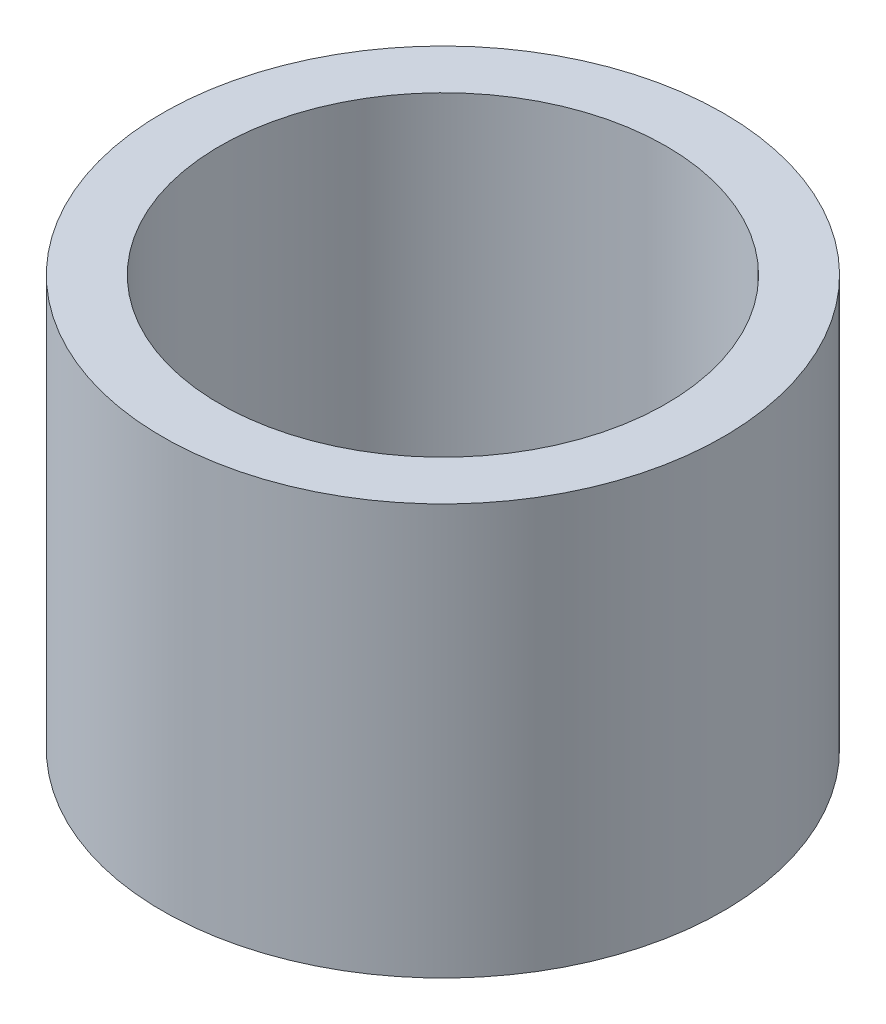
ISO-10303-21;
HEADER;
FILE_DESCRIPTION(('STEP AP214'),'2;1');
FILE_NAME('part.step','',(''),(''),'','','');
FILE_SCHEMA(('AUTOMOTIVE_DESIGN { 1 0 10303 214 1 1 1 1 }'));
ENDSEC;
DATA;
#1=APPLICATION_CONTEXT('core data for automotive mechanical design processes');
#2=APPLICATION_PROTOCOL_DEFINITION('international standard','automotive_design',2000,#1);
#3=PRODUCT_CONTEXT('',#1,'mechanical');
#4=PRODUCT('Part','Part','',(#3));
#5=PRODUCT_RELATED_PRODUCT_CATEGORY('part','',(#4));
#6=PRODUCT_DEFINITION_FORMATION('','',#4);
#7=PRODUCT_DEFINITION_CONTEXT('part definition',#1,'design');
#8=PRODUCT_DEFINITION('design','',#6,#7);
#9=PRODUCT_DEFINITION_SHAPE('','',#8);
#10=(LENGTH_UNIT() NAMED_UNIT(*) SI_UNIT(.MILLI.,.METRE.));
#11=(NAMED_UNIT(*) PLANE_ANGLE_UNIT() SI_UNIT($,.RADIAN.));
#12=(NAMED_UNIT(*) SI_UNIT($,.STERADIAN.) SOLID_ANGLE_UNIT());
#13=UNCERTAINTY_MEASURE_WITH_UNIT(LENGTH_MEASURE(1.E-05),#10,'distance_accuracy_value','');
#14=(GEOMETRIC_REPRESENTATION_CONTEXT(3) GLOBAL_UNCERTAINTY_ASSIGNED_CONTEXT((#13)) GLOBAL_UNIT_ASSIGNED_CONTEXT((#10,
#11,#12)) REPRESENTATION_CONTEXT('',''));
#15=CARTESIAN_POINT('',(0.,0.,0.));
#16=DIRECTION('',(0.,0.,1.));
#17=DIRECTION('',(1.,0.,0.));
#18=AXIS2_PLACEMENT_3D('',#15,#16,#17);
#19=CARTESIAN_POINT('',(0.,25.8695652173913,49.));
#20=DIRECTION('',(0.,-1.,0.));
#21=DIRECTION('',(0.,0.,-1.));
#22=AXIS2_PLACEMENT_3D('',#19,#20,#21);
#23=PLANE('',#22);
#24=CARTESIAN_POINT('',(0.,25.8695652173913,0.));
#25=DIRECTION('',(0.,-1.,0.));
#26=DIRECTION('',(0.,0.,-1.));
#27=AXIS2_PLACEMENT_3D('',#24,#25,#26);
#28=CIRCLE('',#27,49.);
#29=CARTESIAN_POINT('',(0.,25.8695652173913,-49.));
#30=VERTEX_POINT('',#29);
#31=EDGE_CURVE('E44',#30,#30,#28,.T.);
#32=ORIENTED_EDGE('',*,*,#31,.F.);
#33=EDGE_LOOP('',(#32));
#34=FACE_BOUND('',#33,.T.);
#35=CARTESIAN_POINT('',(0.,25.8695652173913,0.));
#36=DIRECTION('',(0.,-1.,0.));
#37=DIRECTION('',(0.,0.,-1.));
#38=AXIS2_PLACEMENT_3D('',#35,#36,#37);
#39=CIRCLE('',#38,39.);
#40=CARTESIAN_POINT('',(0.,25.8695652173913,-39.));
#41=VERTEX_POINT('',#40);
#42=EDGE_CURVE('E10',#41,#41,#39,.T.);
#43=ORIENTED_EDGE('',*,*,#42,.T.);
#44=EDGE_LOOP('',(#43));
#45=FACE_BOUND('',#44,.T.);
#46=ADVANCED_FACE('F30',(#34,#45),#23,.F.);
#47=CARTESIAN_POINT('',(0.,0.,0.));
#48=DIRECTION('',(0.,-1.,0.));
#49=DIRECTION('',(0.,0.,-1.));
#50=AXIS2_PLACEMENT_3D('',#47,#48,#49);
#51=CYLINDRICAL_SURFACE('',#50,39.);
#52=ORIENTED_EDGE('',*,*,#42,.F.);
#53=EDGE_LOOP('',(#52));
#54=FACE_BOUND('',#53,.T.);
#55=CARTESIAN_POINT('',(0.,-45.8695652173913,0.));
#56=DIRECTION('',(0.,-1.,0.));
#57=DIRECTION('',(0.,0.,-1.));
#58=AXIS2_PLACEMENT_3D('',#55,#56,#57);
#59=CIRCLE('',#58,39.);
#60=CARTESIAN_POINT('',(0.,-45.8695652173913,-39.));
#61=VERTEX_POINT('',#60);
#62=EDGE_CURVE('E36',#61,#61,#59,.T.);
#63=ORIENTED_EDGE('',*,*,#62,.T.);
#64=EDGE_LOOP('',(#63));
#65=FACE_BOUND('',#64,.T.);
#66=ADVANCED_FACE('F53',(#54,#65),#51,.F.);
#67=CARTESIAN_POINT('',(0.,-45.8695652173913,39.));
#68=DIRECTION('',(0.,1.,0.));
#69=DIRECTION('',(0.,0.,1.));
#70=AXIS2_PLACEMENT_3D('',#67,#68,#69);
#71=PLANE('',#70);
#72=ORIENTED_EDGE('',*,*,#62,.F.);
#73=EDGE_LOOP('',(#72));
#74=FACE_BOUND('',#73,.T.);
#75=CARTESIAN_POINT('',(0.,-45.8695652173913,0.));
#76=DIRECTION('',(0.,-1.,0.));
#77=DIRECTION('',(0.,0.,-1.));
#78=AXIS2_PLACEMENT_3D('',#75,#76,#77);
#79=CIRCLE('',#78,49.);
#80=CARTESIAN_POINT('',(0.,-45.8695652173913,-49.));
#81=VERTEX_POINT('',#80);
#82=EDGE_CURVE('E40',#81,#81,#79,.T.);
#83=ORIENTED_EDGE('',*,*,#82,.T.);
#84=EDGE_LOOP('',(#83));
#85=FACE_BOUND('',#84,.T.);
#86=ADVANCED_FACE('F57',(#74,#85),#71,.F.);
#87=CARTESIAN_POINT('',(0.,0.,0.));
#88=DIRECTION('',(0.,-1.,0.));
#89=DIRECTION('',(0.,0.,-1.));
#90=AXIS2_PLACEMENT_3D('',#87,#88,#89);
#91=CYLINDRICAL_SURFACE('',#90,49.);
#92=ORIENTED_EDGE('',*,*,#82,.F.);
#93=EDGE_LOOP('',(#92));
#94=FACE_BOUND('',#93,.T.);
#95=ORIENTED_EDGE('',*,*,#31,.T.);
#96=EDGE_LOOP('',(#95));
#97=FACE_BOUND('',#96,.T.);
#98=ADVANCED_FACE('F50',(#94,#97),#91,.T.);
#99=CLOSED_SHELL('',(#46,#66,#86,#98));
#100=MANIFOLD_SOLID_BREP('B2',#99);
#101=ADVANCED_BREP_SHAPE_REPRESENTATION('',(#18,#100),#14);
#102=SHAPE_DEFINITION_REPRESENTATION(#9,#101);
ENDSEC;
END-ISO-10303-21;
